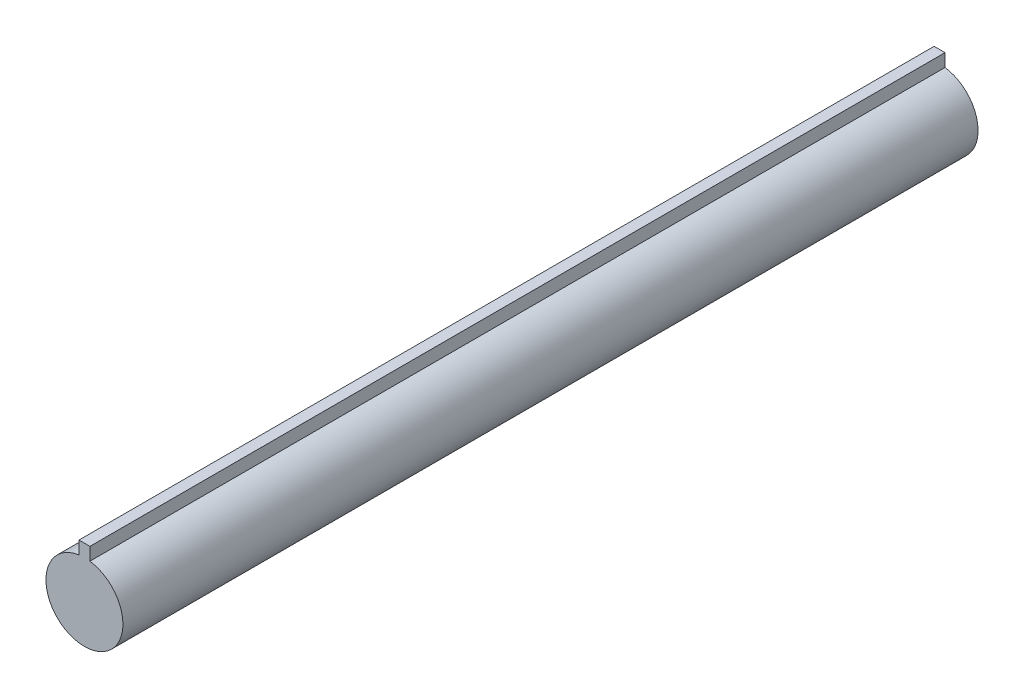
ISO-10303-21;
HEADER;
FILE_DESCRIPTION(('STEP AP214'),'2;1');
FILE_NAME('part.step','',(''),(''),'','','');
FILE_SCHEMA(('AUTOMOTIVE_DESIGN { 1 0 10303 214 1 1 1 1 }'));
ENDSEC;
DATA;
#1=APPLICATION_CONTEXT('core data for automotive mechanical design processes');
#2=APPLICATION_PROTOCOL_DEFINITION('international standard','automotive_design',2000,#1);
#3=PRODUCT_CONTEXT('',#1,'mechanical');
#4=PRODUCT('Part','Part','',(#3));
#5=PRODUCT_RELATED_PRODUCT_CATEGORY('part','',(#4));
#6=PRODUCT_DEFINITION_FORMATION('','',#4);
#7=PRODUCT_DEFINITION_CONTEXT('part definition',#1,'design');
#8=PRODUCT_DEFINITION('design','',#6,#7);
#9=PRODUCT_DEFINITION_SHAPE('','',#8);
#10=(LENGTH_UNIT() NAMED_UNIT(*) SI_UNIT(.MILLI.,.METRE.));
#11=(NAMED_UNIT(*) PLANE_ANGLE_UNIT() SI_UNIT($,.RADIAN.));
#12=(NAMED_UNIT(*) SI_UNIT($,.STERADIAN.) SOLID_ANGLE_UNIT());
#13=UNCERTAINTY_MEASURE_WITH_UNIT(LENGTH_MEASURE(1.E-05),#10,'distance_accuracy_value','');
#14=(GEOMETRIC_REPRESENTATION_CONTEXT(3) GLOBAL_UNCERTAINTY_ASSIGNED_CONTEXT((#13)) GLOBAL_UNIT_ASSIGNED_CONTEXT((#10,
#11,#12)) REPRESENTATION_CONTEXT('',''));
#15=CARTESIAN_POINT('',(0.,0.,0.));
#16=DIRECTION('',(0.,0.,1.));
#17=DIRECTION('',(1.,0.,0.));
#18=AXIS2_PLACEMENT_3D('',#15,#16,#17);
#19=CARTESIAN_POINT('',(0.,0.,100.));
#20=DIRECTION('',(0.,0.,-1.));
#21=DIRECTION('',(-1.,0.,0.));
#22=AXIS2_PLACEMENT_3D('',#19,#20,#21);
#23=CYLINDRICAL_SURFACE('',#22,4.5);
#24=CARTESIAN_POINT('',(0.,0.,0.));
#25=DIRECTION('',(0.,0.,1.));
#26=DIRECTION('',(1.,0.,0.));
#27=AXIS2_PLACEMENT_3D('',#24,#25,#26);
#28=CIRCLE('',#27,4.5);
#29=CARTESIAN_POINT('',(-0.638725324997145,4.45443935408344,0.));
#30=VERTEX_POINT('',#29);
#31=CARTESIAN_POINT('',(0.638725324997145,4.45443935408343,0.));
#32=VERTEX_POINT('',#31);
#33=EDGE_CURVE('E98',#30,#32,#28,.T.);
#34=ORIENTED_EDGE('',*,*,#33,.T.);
#35=DIRECTION('',(0.,0.,-1.));
#36=VECTOR('',#35,1.);
#37=CARTESIAN_POINT('',(0.638725324997145,4.45443935408343,100.));
#38=LINE('',#37,#36);
#39=CARTESIAN_POINT('',(0.638725324997145,4.45443935408343,100.));
#40=VERTEX_POINT('',#39);
#41=EDGE_CURVE('E11',#40,#32,#38,.T.);
#42=ORIENTED_EDGE('',*,*,#41,.F.);
#43=CARTESIAN_POINT('',(0.,0.,100.));
#44=DIRECTION('',(0.,0.,1.));
#45=DIRECTION('',(1.,0.,0.));
#46=AXIS2_PLACEMENT_3D('',#43,#44,#45);
#47=CIRCLE('',#46,4.5);
#48=CARTESIAN_POINT('',(-0.638725324997145,4.45443935408344,100.));
#49=VERTEX_POINT('',#48);
#50=EDGE_CURVE('E86',#49,#40,#47,.T.);
#51=ORIENTED_EDGE('',*,*,#50,.F.);
#52=DIRECTION('',(0.,0.,-1.));
#53=VECTOR('',#52,1.);
#54=CARTESIAN_POINT('',(-0.638725324997145,4.45443935408344,100.));
#55=LINE('',#54,#53);
#56=EDGE_CURVE('E94',#49,#30,#55,.T.);
#57=ORIENTED_EDGE('',*,*,#56,.T.);
#58=EDGE_LOOP('',(#34,#42,#51,#57));
#59=FACE_BOUND('',#58,.T.);
#60=ADVANCED_FACE('F35',(#59),#23,.T.);
#61=CARTESIAN_POINT('',(0.638725324997145,4.45443935408343,100.));
#62=DIRECTION('',(-1.,0.,0.));
#63=DIRECTION('',(0.,0.,1.));
#64=AXIS2_PLACEMENT_3D('',#61,#62,#63);
#65=PLANE('',#64);
#66=DIRECTION('',(0.,1.,0.));
#67=VECTOR('',#66,1.);
#68=CARTESIAN_POINT('',(0.638725324997145,4.45443935408343,0.));
#69=LINE('',#68,#67);
#70=CARTESIAN_POINT('',(0.638725324997145,5.95896513476158,0.));
#71=VERTEX_POINT('',#70);
#72=EDGE_CURVE('E90',#32,#71,#69,.T.);
#73=ORIENTED_EDGE('',*,*,#72,.T.);
#74=DIRECTION('',(0.,0.,-1.));
#75=VECTOR('',#74,1.);
#76=CARTESIAN_POINT('',(0.638725324997145,5.95896513476158,100.));
#77=LINE('',#76,#75);
#78=CARTESIAN_POINT('',(0.638725324997145,5.95896513476158,100.));
#79=VERTEX_POINT('',#78);
#80=EDGE_CURVE('E43',#79,#71,#77,.T.);
#81=ORIENTED_EDGE('',*,*,#80,.F.);
#82=DIRECTION('',(0.,1.,0.));
#83=VECTOR('',#82,1.);
#84=CARTESIAN_POINT('',(0.638725324997145,4.45443935408343,100.));
#85=LINE('',#84,#83);
#86=EDGE_CURVE('E81',#40,#79,#85,.T.);
#87=ORIENTED_EDGE('',*,*,#86,.F.);
#88=ORIENTED_EDGE('',*,*,#41,.T.);
#89=EDGE_LOOP('',(#73,#81,#87,#88));
#90=FACE_BOUND('',#89,.T.);
#91=ADVANCED_FACE('F89',(#90),#65,.F.);
#92=CARTESIAN_POINT('',(-0.638725324997145,5.95896513476159,100.));
#93=DIRECTION('',(0.,-1.,0.));
#94=DIRECTION('',(1.,0.,0.));
#95=AXIS2_PLACEMENT_3D('',#92,#93,#94);
#96=PLANE('',#95);
#97=DIRECTION('',(-1.,0.,0.));
#98=VECTOR('',#97,1.);
#99=CARTESIAN_POINT('',(-0.638725324997145,5.95896513476159,0.));
#100=LINE('',#99,#98);
#101=CARTESIAN_POINT('',(-0.638725324997145,5.95896513476159,0.));
#102=VERTEX_POINT('',#101);
#103=EDGE_CURVE('E68',#71,#102,#100,.T.);
#104=ORIENTED_EDGE('',*,*,#103,.T.);
#105=DIRECTION('',(0.,0.,-1.));
#106=VECTOR('',#105,1.);
#107=CARTESIAN_POINT('',(-0.638725324997145,5.95896513476159,100.));
#108=LINE('',#107,#106);
#109=CARTESIAN_POINT('',(-0.638725324997145,5.95896513476159,100.));
#110=VERTEX_POINT('',#109);
#111=EDGE_CURVE('E91',#110,#102,#108,.T.);
#112=ORIENTED_EDGE('',*,*,#111,.F.);
#113=DIRECTION('',(-1.,0.,0.));
#114=VECTOR('',#113,1.);
#115=CARTESIAN_POINT('',(-0.638725324997145,5.95896513476159,100.));
#116=LINE('',#115,#114);
#117=EDGE_CURVE('E84',#79,#110,#116,.T.);
#118=ORIENTED_EDGE('',*,*,#117,.F.);
#119=ORIENTED_EDGE('',*,*,#80,.T.);
#120=EDGE_LOOP('',(#104,#112,#118,#119));
#121=FACE_BOUND('',#120,.T.);
#122=ADVANCED_FACE('F92',(#121),#96,.F.);
#123=CARTESIAN_POINT('',(-0.638725324997145,4.45443935408344,100.));
#124=DIRECTION('',(1.,0.,0.));
#125=DIRECTION('',(0.,0.,-1.));
#126=AXIS2_PLACEMENT_3D('',#123,#124,#125);
#127=PLANE('',#126);
#128=DIRECTION('',(0.,-1.,0.));
#129=VECTOR('',#128,1.);
#130=CARTESIAN_POINT('',(-0.638725324997145,4.45443935408344,0.));
#131=LINE('',#130,#129);
#132=EDGE_CURVE('E74',#102,#30,#131,.T.);
#133=ORIENTED_EDGE('',*,*,#132,.T.);
#134=ORIENTED_EDGE('',*,*,#56,.F.);
#135=DIRECTION('',(0.,-1.,0.));
#136=VECTOR('',#135,1.);
#137=CARTESIAN_POINT('',(-0.638725324997145,4.45443935408344,100.));
#138=LINE('',#137,#136);
#139=EDGE_CURVE('E51',#110,#49,#138,.T.);
#140=ORIENTED_EDGE('',*,*,#139,.F.);
#141=ORIENTED_EDGE('',*,*,#111,.T.);
#142=EDGE_LOOP('',(#133,#134,#140,#141));
#143=FACE_BOUND('',#142,.T.);
#144=ADVANCED_FACE('F105',(#143),#127,.F.);
#145=CARTESIAN_POINT('',(0.,0.,100.));
#146=DIRECTION('',(0.,0.,1.));
#147=DIRECTION('',(1.,0.,0.));
#148=AXIS2_PLACEMENT_3D('',#145,#146,#147);
#149=PLANE('',#148);
#150=ORIENTED_EDGE('',*,*,#50,.T.);
#151=ORIENTED_EDGE('',*,*,#86,.T.);
#152=ORIENTED_EDGE('',*,*,#117,.T.);
#153=ORIENTED_EDGE('',*,*,#139,.T.);
#154=EDGE_LOOP('',(#150,#151,#152,#153));
#155=FACE_BOUND('',#154,.T.);
#156=ADVANCED_FACE('F82',(#155),#149,.T.);
#157=CARTESIAN_POINT('',(0.,0.,0.));
#158=DIRECTION('',(0.,0.,1.));
#159=DIRECTION('',(1.,0.,0.));
#160=AXIS2_PLACEMENT_3D('',#157,#158,#159);
#161=PLANE('',#160);
#162=ORIENTED_EDGE('',*,*,#33,.F.);
#163=ORIENTED_EDGE('',*,*,#132,.F.);
#164=ORIENTED_EDGE('',*,*,#103,.F.);
#165=ORIENTED_EDGE('',*,*,#72,.F.);
#166=EDGE_LOOP('',(#162,#163,#164,#165));
#167=FACE_BOUND('',#166,.T.);
#168=ADVANCED_FACE('F108',(#167),#161,.F.);
#169=CLOSED_SHELL('',(#60,#91,#122,#144,#156,#168));
#170=MANIFOLD_SOLID_BREP('B2',#169);
#171=ADVANCED_BREP_SHAPE_REPRESENTATION('',(#18,#170),#14);
#172=SHAPE_DEFINITION_REPRESENTATION(#9,#171);
ENDSEC;
END-ISO-10303-21;
